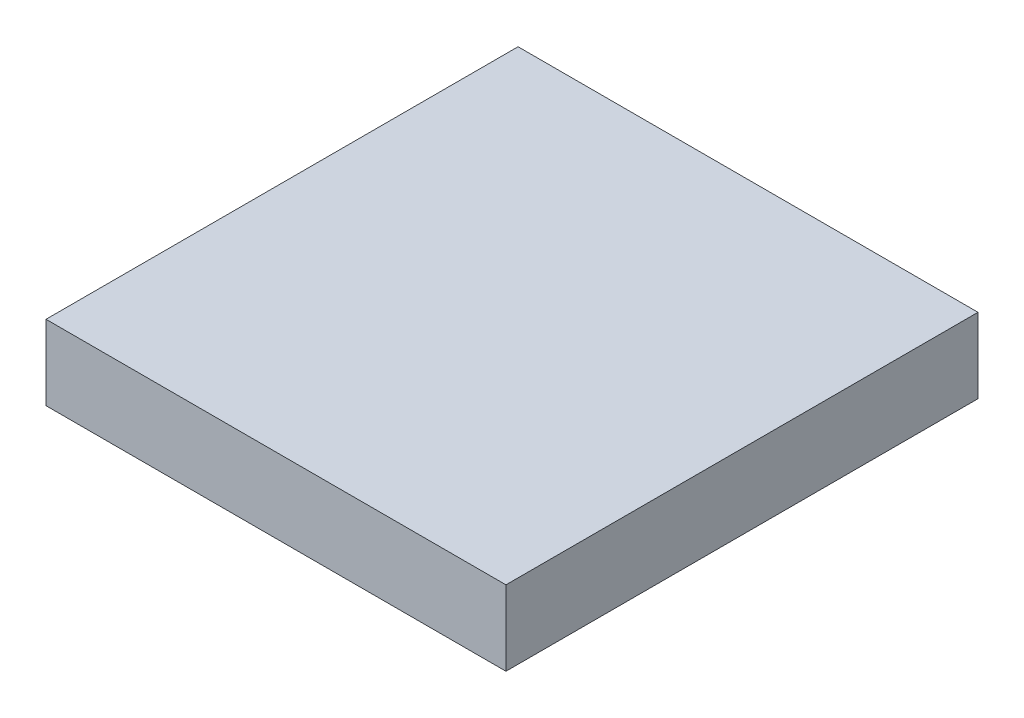
ISO-10303-21;
HEADER;
FILE_DESCRIPTION(('STEP AP214'),'2;1');
FILE_NAME('part.step','',(''),(''),'','','');
FILE_SCHEMA(('AUTOMOTIVE_DESIGN { 1 0 10303 214 1 1 1 1 }'));
ENDSEC;
DATA;
#1=APPLICATION_CONTEXT('core data for automotive mechanical design processes');
#2=APPLICATION_PROTOCOL_DEFINITION('international standard','automotive_design',2000,#1);
#3=PRODUCT_CONTEXT('',#1,'mechanical');
#4=PRODUCT('Part','Part','',(#3));
#5=PRODUCT_RELATED_PRODUCT_CATEGORY('part','',(#4));
#6=PRODUCT_DEFINITION_FORMATION('','',#4);
#7=PRODUCT_DEFINITION_CONTEXT('part definition',#1,'design');
#8=PRODUCT_DEFINITION('design','',#6,#7);
#9=PRODUCT_DEFINITION_SHAPE('','',#8);
#10=(LENGTH_UNIT() NAMED_UNIT(*) SI_UNIT(.MILLI.,.METRE.));
#11=(NAMED_UNIT(*) PLANE_ANGLE_UNIT() SI_UNIT($,.RADIAN.));
#12=(NAMED_UNIT(*) SI_UNIT($,.STERADIAN.) SOLID_ANGLE_UNIT());
#13=UNCERTAINTY_MEASURE_WITH_UNIT(LENGTH_MEASURE(1.E-05),#10,'distance_accuracy_value','');
#14=(GEOMETRIC_REPRESENTATION_CONTEXT(3) GLOBAL_UNCERTAINTY_ASSIGNED_CONTEXT((#13)) GLOBAL_UNIT_ASSIGNED_CONTEXT((#10,
#11,#12)) REPRESENTATION_CONTEXT('',''));
#15=CARTESIAN_POINT('',(0.,0.,0.));
#16=DIRECTION('',(0.,0.,1.));
#17=DIRECTION('',(1.,0.,0.));
#18=AXIS2_PLACEMENT_3D('',#15,#16,#17);
#19=CARTESIAN_POINT('',(15.3608941485865,5.,15.7651282051282));
#20=DIRECTION('',(-1.,0.,0.));
#21=DIRECTION('',(0.,0.,1.));
#22=AXIS2_PLACEMENT_3D('',#19,#20,#21);
#23=PLANE('',#22);
#24=DIRECTION('',(0.,0.,-1.));
#25=VECTOR('',#24,1.);
#26=CARTESIAN_POINT('',(15.3608941485865,0.,15.7651282051282));
#27=LINE('',#26,#25);
#28=CARTESIAN_POINT('',(15.3608941485865,0.,15.7651282051282));
#29=VERTEX_POINT('',#28);
#30=CARTESIAN_POINT('',(15.3608941485865,0.,-15.7651282051282));
#31=VERTEX_POINT('',#30);
#32=EDGE_CURVE('E113',#29,#31,#27,.T.);
#33=ORIENTED_EDGE('',*,*,#32,.T.);
#34=DIRECTION('',(0.,-1.,0.));
#35=VECTOR('',#34,1.);
#36=CARTESIAN_POINT('',(15.3608941485865,5.,-15.7651282051282));
#37=LINE('',#36,#35);
#38=CARTESIAN_POINT('',(15.3608941485865,5.,-15.7651282051282));
#39=VERTEX_POINT('',#38);
#40=EDGE_CURVE('E11',#39,#31,#37,.T.);
#41=ORIENTED_EDGE('',*,*,#40,.F.);
#42=DIRECTION('',(0.,0.,-1.));
#43=VECTOR('',#42,1.);
#44=CARTESIAN_POINT('',(15.3608941485865,5.,15.7651282051282));
#45=LINE('',#44,#43);
#46=CARTESIAN_POINT('',(15.3608941485865,5.,15.7651282051282));
#47=VERTEX_POINT('',#46);
#48=EDGE_CURVE('E97',#47,#39,#45,.T.);
#49=ORIENTED_EDGE('',*,*,#48,.F.);
#50=DIRECTION('',(0.,-1.,0.));
#51=VECTOR('',#50,1.);
#52=CARTESIAN_POINT('',(15.3608941485865,5.,15.7651282051282));
#53=LINE('',#52,#51);
#54=EDGE_CURVE('E109',#47,#29,#53,.T.);
#55=ORIENTED_EDGE('',*,*,#54,.T.);
#56=EDGE_LOOP('',(#33,#41,#49,#55));
#57=FACE_BOUND('',#56,.T.);
#58=ADVANCED_FACE('F45',(#57),#23,.F.);
#59=CARTESIAN_POINT('',(-15.3608941485865,5.,-15.7651282051282));
#60=DIRECTION('',(0.,0.,1.));
#61=DIRECTION('',(1.,0.,0.));
#62=AXIS2_PLACEMENT_3D('',#59,#60,#61);
#63=PLANE('',#62);
#64=DIRECTION('',(-1.,0.,0.));
#65=VECTOR('',#64,1.);
#66=CARTESIAN_POINT('',(-15.3608941485865,0.,-15.7651282051282));
#67=LINE('',#66,#65);
#68=CARTESIAN_POINT('',(-15.3608941485865,0.,-15.7651282051282));
#69=VERTEX_POINT('',#68);
#70=EDGE_CURVE('E102',#31,#69,#67,.T.);
#71=ORIENTED_EDGE('',*,*,#70,.T.);
#72=DIRECTION('',(0.,-1.,0.));
#73=VECTOR('',#72,1.);
#74=CARTESIAN_POINT('',(-15.3608941485865,5.,-15.7651282051282));
#75=LINE('',#74,#73);
#76=CARTESIAN_POINT('',(-15.3608941485865,5.,-15.7651282051282));
#77=VERTEX_POINT('',#76);
#78=EDGE_CURVE('E54',#77,#69,#75,.T.);
#79=ORIENTED_EDGE('',*,*,#78,.F.);
#80=DIRECTION('',(-1.,0.,0.));
#81=VECTOR('',#80,1.);
#82=CARTESIAN_POINT('',(-15.3608941485865,5.,-15.7651282051282));
#83=LINE('',#82,#81);
#84=EDGE_CURVE('E92',#39,#77,#83,.T.);
#85=ORIENTED_EDGE('',*,*,#84,.F.);
#86=ORIENTED_EDGE('',*,*,#40,.T.);
#87=EDGE_LOOP('',(#71,#79,#85,#86));
#88=FACE_BOUND('',#87,.T.);
#89=ADVANCED_FACE('F101',(#88),#63,.F.);
#90=CARTESIAN_POINT('',(-15.3608941485865,5.,15.7651282051282));
#91=DIRECTION('',(1.,0.,0.));
#92=DIRECTION('',(0.,0.,-1.));
#93=AXIS2_PLACEMENT_3D('',#90,#91,#92);
#94=PLANE('',#93);
#95=DIRECTION('',(0.,0.,1.));
#96=VECTOR('',#95,1.);
#97=CARTESIAN_POINT('',(-15.3608941485865,0.,15.7651282051282));
#98=LINE('',#97,#96);
#99=CARTESIAN_POINT('',(-15.3608941485865,0.,15.7651282051282));
#100=VERTEX_POINT('',#99);
#101=EDGE_CURVE('E79',#69,#100,#98,.T.);
#102=ORIENTED_EDGE('',*,*,#101,.T.);
#103=DIRECTION('',(0.,-1.,0.));
#104=VECTOR('',#103,1.);
#105=CARTESIAN_POINT('',(-15.3608941485865,5.,15.7651282051282));
#106=LINE('',#105,#104);
#107=CARTESIAN_POINT('',(-15.3608941485865,5.,15.7651282051282));
#108=VERTEX_POINT('',#107);
#109=EDGE_CURVE('E104',#108,#100,#106,.T.);
#110=ORIENTED_EDGE('',*,*,#109,.F.);
#111=DIRECTION('',(0.,0.,1.));
#112=VECTOR('',#111,1.);
#113=CARTESIAN_POINT('',(-15.3608941485865,5.,15.7651282051282));
#114=LINE('',#113,#112);
#115=EDGE_CURVE('E95',#77,#108,#114,.T.);
#116=ORIENTED_EDGE('',*,*,#115,.F.);
#117=ORIENTED_EDGE('',*,*,#78,.T.);
#118=EDGE_LOOP('',(#102,#110,#116,#117));
#119=FACE_BOUND('',#118,.T.);
#120=ADVANCED_FACE('F105',(#119),#94,.F.);
#121=CARTESIAN_POINT('',(-15.3608941485865,5.,15.7651282051282));
#122=DIRECTION('',(0.,0.,-1.));
#123=DIRECTION('',(-1.,0.,0.));
#124=AXIS2_PLACEMENT_3D('',#121,#122,#123);
#125=PLANE('',#124);
#126=DIRECTION('',(1.,0.,0.));
#127=VECTOR('',#126,1.);
#128=CARTESIAN_POINT('',(-15.3608941485865,0.,15.7651282051282));
#129=LINE('',#128,#127);
#130=EDGE_CURVE('E85',#100,#29,#129,.T.);
#131=ORIENTED_EDGE('',*,*,#130,.T.);
#132=ORIENTED_EDGE('',*,*,#54,.F.);
#133=DIRECTION('',(1.,0.,0.));
#134=VECTOR('',#133,1.);
#135=CARTESIAN_POINT('',(-15.3608941485865,5.,15.7651282051282));
#136=LINE('',#135,#134);
#137=EDGE_CURVE('E62',#108,#47,#136,.T.);
#138=ORIENTED_EDGE('',*,*,#137,.F.);
#139=ORIENTED_EDGE('',*,*,#109,.T.);
#140=EDGE_LOOP('',(#131,#132,#138,#139));
#141=FACE_BOUND('',#140,.T.);
#142=ADVANCED_FACE('F126',(#141),#125,.F.);
#143=CARTESIAN_POINT('',(0.,5.,0.));
#144=DIRECTION('',(0.,-1.,0.));
#145=DIRECTION('',(0.,0.,-1.));
#146=AXIS2_PLACEMENT_3D('',#143,#144,#145);
#147=PLANE('',#146);
#148=ORIENTED_EDGE('',*,*,#48,.T.);
#149=ORIENTED_EDGE('',*,*,#84,.T.);
#150=ORIENTED_EDGE('',*,*,#115,.T.);
#151=ORIENTED_EDGE('',*,*,#137,.T.);
#152=EDGE_LOOP('',(#148,#149,#150,#151));
#153=FACE_BOUND('',#152,.T.);
#154=ADVANCED_FACE('F93',(#153),#147,.F.);
#155=CARTESIAN_POINT('',(0.,0.,0.));
#156=DIRECTION('',(0.,-1.,0.));
#157=DIRECTION('',(0.,0.,-1.));
#158=AXIS2_PLACEMENT_3D('',#155,#156,#157);
#159=PLANE('',#158);
#160=ORIENTED_EDGE('',*,*,#32,.F.);
#161=ORIENTED_EDGE('',*,*,#130,.F.);
#162=ORIENTED_EDGE('',*,*,#101,.F.);
#163=ORIENTED_EDGE('',*,*,#70,.F.);
#164=EDGE_LOOP('',(#160,#161,#162,#163));
#165=FACE_BOUND('',#164,.T.);
#166=ADVANCED_FACE('F129',(#165),#159,.T.);
#167=CLOSED_SHELL('',(#58,#89,#120,#142,#154,#166));
#168=MANIFOLD_SOLID_BREP('B2',#167);
#169=ADVANCED_BREP_SHAPE_REPRESENTATION('',(#18,#168),#14);
#170=SHAPE_DEFINITION_REPRESENTATION(#9,#169);
ENDSEC;
END-ISO-10303-21;
